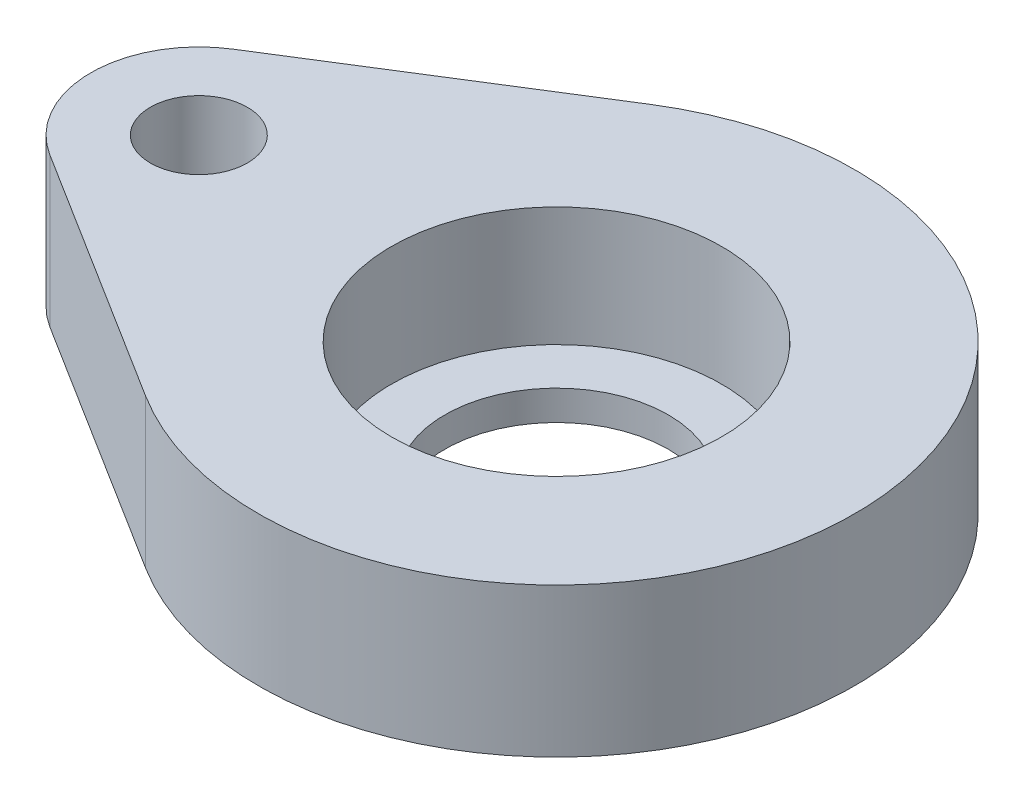
ISO-10303-21;
HEADER;
FILE_DESCRIPTION(('STEP AP214'),'2;1');
FILE_NAME('part.step','',(''),(''),'','','');
FILE_SCHEMA(('AUTOMOTIVE_DESIGN { 1 0 10303 214 1 1 1 1 }'));
ENDSEC;
DATA;
#1=APPLICATION_CONTEXT('core data for automotive mechanical design processes');
#2=APPLICATION_PROTOCOL_DEFINITION('international standard','automotive_design',2000,#1);
#3=PRODUCT_CONTEXT('',#1,'mechanical');
#4=PRODUCT('Part','Part','',(#3));
#5=PRODUCT_RELATED_PRODUCT_CATEGORY('part','',(#4));
#6=PRODUCT_DEFINITION_FORMATION('','',#4);
#7=PRODUCT_DEFINITION_CONTEXT('part definition',#1,'design');
#8=PRODUCT_DEFINITION('design','',#6,#7);
#9=PRODUCT_DEFINITION_SHAPE('','',#8);
#10=(LENGTH_UNIT() NAMED_UNIT(*) SI_UNIT(.MILLI.,.METRE.));
#11=(NAMED_UNIT(*) PLANE_ANGLE_UNIT() SI_UNIT($,.RADIAN.));
#12=(NAMED_UNIT(*) SI_UNIT($,.STERADIAN.) SOLID_ANGLE_UNIT());
#13=UNCERTAINTY_MEASURE_WITH_UNIT(LENGTH_MEASURE(1.E-05),#10,'distance_accuracy_value','');
#14=(GEOMETRIC_REPRESENTATION_CONTEXT(3) GLOBAL_UNCERTAINTY_ASSIGNED_CONTEXT((#13)) GLOBAL_UNIT_ASSIGNED_CONTEXT((#10,
#11,#12)) REPRESENTATION_CONTEXT('',''));
#15=CARTESIAN_POINT('',(0.,0.,0.));
#16=DIRECTION('',(0.,0.,1.));
#17=DIRECTION('',(1.,0.,0.));
#18=AXIS2_PLACEMENT_3D('',#15,#16,#17);
#19=CARTESIAN_POINT('',(0.,10.,0.));
#20=DIRECTION('',(0.,-1.,0.));
#21=DIRECTION('',(0.,0.,-1.));
#22=AXIS2_PLACEMENT_3D('',#19,#20,#21);
#23=CYLINDRICAL_SURFACE('',#22,7.25);
#24=CARTESIAN_POINT('',(0.,0.,0.));
#25=DIRECTION('',(0.,1.,0.));
#26=DIRECTION('',(0.,0.,1.));
#27=AXIS2_PLACEMENT_3D('',#24,#25,#26);
#28=CIRCLE('',#27,7.25);
#29=CARTESIAN_POINT('',(-3.8515625,0.,-6.14230952562582));
#30=VERTEX_POINT('',#29);
#31=CARTESIAN_POINT('',(-3.8515625,0.,6.14230952562582));
#32=VERTEX_POINT('',#31);
#33=EDGE_CURVE('E100',#30,#32,#28,.T.);
#34=ORIENTED_EDGE('',*,*,#33,.T.);
#35=DIRECTION('',(0.,-1.,0.));
#36=VECTOR('',#35,1.);
#37=CARTESIAN_POINT('',(-3.8515625,10.,6.14230952562582));
#38=LINE('',#37,#36);
#39=CARTESIAN_POINT('',(-3.8515625,10.,6.14230952562582));
#40=VERTEX_POINT('',#39);
#41=EDGE_CURVE('E11',#40,#32,#38,.T.);
#42=ORIENTED_EDGE('',*,*,#41,.F.);
#43=CARTESIAN_POINT('',(0.,10.,0.));
#44=DIRECTION('',(0.,1.,0.));
#45=DIRECTION('',(0.,0.,1.));
#46=AXIS2_PLACEMENT_3D('',#43,#44,#45);
#47=CIRCLE('',#46,7.25);
#48=CARTESIAN_POINT('',(-3.8515625,10.,-6.14230952562582));
#49=VERTEX_POINT('',#48);
#50=EDGE_CURVE('E88',#49,#40,#47,.T.);
#51=ORIENTED_EDGE('',*,*,#50,.F.);
#52=DIRECTION('',(0.,-1.,0.));
#53=VECTOR('',#52,1.);
#54=CARTESIAN_POINT('',(-3.8515625,10.,-6.14230952562582));
#55=LINE('',#54,#53);
#56=EDGE_CURVE('E96',#49,#30,#55,.T.);
#57=ORIENTED_EDGE('',*,*,#56,.T.);
#58=EDGE_LOOP('',(#34,#42,#51,#57));
#59=FACE_BOUND('',#58,.T.);
#60=ADVANCED_FACE('F37',(#59),#23,.T.);
#61=CARTESIAN_POINT('',(-3.8515625,10.,6.14230952562582));
#62=DIRECTION('',(0.53125,0.,-0.847215106982873));
#63=DIRECTION('',(-0.847215106982873,0.,-0.53125));
#64=AXIS2_PLACEMENT_3D('',#61,#62,#63);
#65=PLANE('',#64);
#66=DIRECTION('',(0.847215106982873,0.,0.53125));
#67=VECTOR('',#66,1.);
#68=CARTESIAN_POINT('',(-3.8515625,0.,6.14230952562582));
#69=LINE('',#68,#67);
#70=CARTESIAN_POINT('',(13.375,0.,16.9443021396575));
#71=VERTEX_POINT('',#70);
#72=EDGE_CURVE('E92',#32,#71,#69,.T.);
#73=ORIENTED_EDGE('',*,*,#72,.T.);
#74=DIRECTION('',(0.,-1.,0.));
#75=VECTOR('',#74,1.);
#76=CARTESIAN_POINT('',(13.375,10.,16.9443021396575));
#77=LINE('',#76,#75);
#78=CARTESIAN_POINT('',(13.375,10.,16.9443021396575));
#79=VERTEX_POINT('',#78);
#80=EDGE_CURVE('E45',#79,#71,#77,.T.);
#81=ORIENTED_EDGE('',*,*,#80,.F.);
#82=DIRECTION('',(0.847215106982873,0.,0.53125));
#83=VECTOR('',#82,1.);
#84=CARTESIAN_POINT('',(-3.8515625,10.,6.14230952562582));
#85=LINE('',#84,#83);
#86=EDGE_CURVE('E83',#40,#79,#85,.T.);
#87=ORIENTED_EDGE('',*,*,#86,.F.);
#88=ORIENTED_EDGE('',*,*,#41,.T.);
#89=EDGE_LOOP('',(#73,#81,#87,#88));
#90=FACE_BOUND('',#89,.T.);
#91=ADVANCED_FACE('F91',(#90),#65,.F.);
#92=CARTESIAN_POINT('',(24.,10.,0.));
#93=DIRECTION('',(0.,-1.,0.));
#94=DIRECTION('',(0.,0.,-1.));
#95=AXIS2_PLACEMENT_3D('',#92,#93,#94);
#96=CYLINDRICAL_SURFACE('',#95,20.);
#97=CARTESIAN_POINT('',(24.,0.,0.));
#98=DIRECTION('',(0.,1.,0.));
#99=DIRECTION('',(0.,0.,-1.));
#100=AXIS2_PLACEMENT_3D('',#97,#98,#99);
#101=CIRCLE('',#100,20.);
#102=CARTESIAN_POINT('',(13.375,0.,-16.9443021396574));
#103=VERTEX_POINT('',#102);
#104=EDGE_CURVE('E70',#71,#103,#101,.T.);
#105=ORIENTED_EDGE('',*,*,#104,.T.);
#106=DIRECTION('',(0.,-1.,0.));
#107=VECTOR('',#106,1.);
#108=CARTESIAN_POINT('',(13.375,10.,-16.9443021396574));
#109=LINE('',#108,#107);
#110=CARTESIAN_POINT('',(13.375,10.,-16.9443021396574));
#111=VERTEX_POINT('',#110);
#112=EDGE_CURVE('E93',#111,#103,#109,.T.);
#113=ORIENTED_EDGE('',*,*,#112,.F.);
#114=CARTESIAN_POINT('',(24.,10.,0.));
#115=DIRECTION('',(0.,1.,0.));
#116=DIRECTION('',(0.,0.,-1.));
#117=AXIS2_PLACEMENT_3D('',#114,#115,#116);
#118=CIRCLE('',#117,20.);
#119=EDGE_CURVE('E86',#79,#111,#118,.T.);
#120=ORIENTED_EDGE('',*,*,#119,.F.);
#121=ORIENTED_EDGE('',*,*,#80,.T.);
#122=EDGE_LOOP('',(#105,#113,#120,#121));
#123=FACE_BOUND('',#122,.T.);
#124=ADVANCED_FACE('F94',(#123),#96,.T.);
#125=CARTESIAN_POINT('',(-3.8515625,10.,-6.14230952562582));
#126=DIRECTION('',(0.53125,0.,0.847215106982873));
#127=DIRECTION('',(0.847215106982872,0.,-0.53125));
#128=AXIS2_PLACEMENT_3D('',#125,#126,#127);
#129=PLANE('',#128);
#130=DIRECTION('',(-0.847215106982873,0.,0.53125));
#131=VECTOR('',#130,1.);
#132=CARTESIAN_POINT('',(-3.8515625,0.,-6.14230952562582));
#133=LINE('',#132,#131);
#134=EDGE_CURVE('E76',#103,#30,#133,.T.);
#135=ORIENTED_EDGE('',*,*,#134,.T.);
#136=ORIENTED_EDGE('',*,*,#56,.F.);
#137=DIRECTION('',(-0.847215106982873,0.,0.53125));
#138=VECTOR('',#137,1.);
#139=CARTESIAN_POINT('',(-3.8515625,10.,-6.14230952562582));
#140=LINE('',#139,#138);
#141=EDGE_CURVE('E53',#111,#49,#140,.T.);
#142=ORIENTED_EDGE('',*,*,#141,.F.);
#143=ORIENTED_EDGE('',*,*,#112,.T.);
#144=EDGE_LOOP('',(#135,#136,#142,#143));
#145=FACE_BOUND('',#144,.T.);
#146=ADVANCED_FACE('F108',(#145),#129,.F.);
#147=CARTESIAN_POINT('',(0.,10.,0.));
#148=DIRECTION('',(0.,1.,0.));
#149=DIRECTION('',(0.,0.,1.));
#150=AXIS2_PLACEMENT_3D('',#147,#148,#149);
#151=PLANE('',#150);
#152=CARTESIAN_POINT('',(0.,10.,0.));
#153=DIRECTION('',(0.,1.,0.));
#154=DIRECTION('',(0.,0.,1.));
#155=AXIS2_PLACEMENT_3D('',#152,#153,#154);
#156=CIRCLE('',#155,3.25);
#157=CARTESIAN_POINT('',(0.,10.,3.25));
#158=VERTEX_POINT('',#157);
#159=EDGE_CURVE('E121',#158,#158,#156,.T.);
#160=ORIENTED_EDGE('',*,*,#159,.F.);
#161=EDGE_LOOP('',(#160));
#162=FACE_BOUND('',#161,.T.);
#163=CARTESIAN_POINT('',(24.,10.,0.));
#164=DIRECTION('',(0.,1.,0.));
#165=DIRECTION('',(0.,0.,1.));
#166=AXIS2_PLACEMENT_3D('',#163,#164,#165);
#167=CIRCLE('',#166,11.075);
#168=CARTESIAN_POINT('',(24.,10.,11.075));
#169=VERTEX_POINT('',#168);
#170=EDGE_CURVE('E117',#169,#169,#167,.T.);
#171=ORIENTED_EDGE('',*,*,#170,.F.);
#172=EDGE_LOOP('',(#171));
#173=FACE_BOUND('',#172,.T.);
#174=ORIENTED_EDGE('',*,*,#50,.T.);
#175=ORIENTED_EDGE('',*,*,#86,.T.);
#176=ORIENTED_EDGE('',*,*,#119,.T.);
#177=ORIENTED_EDGE('',*,*,#141,.T.);
#178=EDGE_LOOP('',(#174,#175,#176,#177));
#179=FACE_BOUND('',#178,.T.);
#180=ADVANCED_FACE('F84',(#162,#173,#179),#151,.T.);
#181=CARTESIAN_POINT('',(0.,0.,0.));
#182=DIRECTION('',(0.,1.,0.));
#183=DIRECTION('',(0.,0.,1.));
#184=AXIS2_PLACEMENT_3D('',#181,#182,#183);
#185=PLANE('',#184);
#186=CARTESIAN_POINT('',(24.,0.,0.));
#187=DIRECTION('',(0.,1.,0.));
#188=DIRECTION('',(0.,0.,1.));
#189=AXIS2_PLACEMENT_3D('',#186,#187,#188);
#190=CIRCLE('',#189,7.5);
#191=CARTESIAN_POINT('',(24.,0.,7.5));
#192=VERTEX_POINT('',#191);
#193=EDGE_CURVE('E118',#192,#192,#190,.F.);
#194=ORIENTED_EDGE('',*,*,#193,.F.);
#195=EDGE_LOOP('',(#194));
#196=FACE_BOUND('',#195,.T.);
#197=CARTESIAN_POINT('',(0.,0.,0.));
#198=DIRECTION('',(0.,1.,0.));
#199=DIRECTION('',(0.,0.,1.));
#200=AXIS2_PLACEMENT_3D('',#197,#198,#199);
#201=CIRCLE('',#200,1.5);
#202=CARTESIAN_POINT('',(0.,0.,1.5));
#203=VERTEX_POINT('',#202);
#204=EDGE_CURVE('E130',#203,#203,#201,.F.);
#205=ORIENTED_EDGE('',*,*,#204,.F.);
#206=EDGE_LOOP('',(#205));
#207=FACE_BOUND('',#206,.T.);
#208=ORIENTED_EDGE('',*,*,#33,.F.);
#209=ORIENTED_EDGE('',*,*,#134,.F.);
#210=ORIENTED_EDGE('',*,*,#104,.F.);
#211=ORIENTED_EDGE('',*,*,#72,.F.);
#212=EDGE_LOOP('',(#208,#209,#210,#211));
#213=FACE_BOUND('',#212,.T.);
#214=ADVANCED_FACE('F111',(#196,#207,#213),#185,.F.);
#215=CARTESIAN_POINT('',(24.,2.,0.));
#216=DIRECTION('',(0.,1.,0.));
#217=DIRECTION('',(0.,0.,1.));
#218=AXIS2_PLACEMENT_3D('',#215,#216,#217);
#219=CYLINDRICAL_SURFACE('',#218,11.075);
#220=CARTESIAN_POINT('',(24.,2.,0.));
#221=DIRECTION('',(0.,1.,0.));
#222=DIRECTION('',(0.,0.,1.));
#223=AXIS2_PLACEMENT_3D('',#220,#221,#222);
#224=CIRCLE('',#223,11.075);
#225=CARTESIAN_POINT('',(24.,2.,11.075));
#226=VERTEX_POINT('',#225);
#227=EDGE_CURVE('E114',#226,#226,#224,.T.);
#228=ORIENTED_EDGE('',*,*,#227,.F.);
#229=EDGE_LOOP('',(#228));
#230=FACE_BOUND('',#229,.T.);
#231=ORIENTED_EDGE('',*,*,#170,.T.);
#232=EDGE_LOOP('',(#231));
#233=FACE_BOUND('',#232,.T.);
#234=ADVANCED_FACE('F144',(#230,#233),#219,.F.);
#235=CARTESIAN_POINT('',(24.,2.,0.));
#236=DIRECTION('',(0.,1.,0.));
#237=DIRECTION('',(0.,0.,1.));
#238=AXIS2_PLACEMENT_3D('',#235,#236,#237);
#239=PLANE('',#238);
#240=CARTESIAN_POINT('',(24.,2.,0.));
#241=DIRECTION('',(0.,1.,0.));
#242=DIRECTION('',(0.,0.,1.));
#243=AXIS2_PLACEMENT_3D('',#240,#241,#242);
#244=CIRCLE('',#243,7.5);
#245=CARTESIAN_POINT('',(24.,2.,7.5));
#246=VERTEX_POINT('',#245);
#247=EDGE_CURVE('E129',#246,#246,#244,.T.);
#248=ORIENTED_EDGE('',*,*,#247,.F.);
#249=EDGE_LOOP('',(#248));
#250=FACE_BOUND('',#249,.T.);
#251=ORIENTED_EDGE('',*,*,#227,.T.);
#252=EDGE_LOOP('',(#251));
#253=FACE_BOUND('',#252,.T.);
#254=ADVANCED_FACE('F140',(#250,#253),#239,.T.);
#255=CARTESIAN_POINT('',(0.,2.,0.));
#256=DIRECTION('',(0.,1.,0.));
#257=DIRECTION('',(0.,0.,1.));
#258=AXIS2_PLACEMENT_3D('',#255,#256,#257);
#259=CYLINDRICAL_SURFACE('',#258,3.25);
#260=CARTESIAN_POINT('',(0.,2.,0.));
#261=DIRECTION('',(0.,1.,0.));
#262=DIRECTION('',(0.,0.,1.));
#263=AXIS2_PLACEMENT_3D('',#260,#261,#262);
#264=CIRCLE('',#263,3.25);
#265=CARTESIAN_POINT('',(0.,2.,3.25));
#266=VERTEX_POINT('',#265);
#267=EDGE_CURVE('E103',#266,#266,#264,.T.);
#268=ORIENTED_EDGE('',*,*,#267,.F.);
#269=EDGE_LOOP('',(#268));
#270=FACE_BOUND('',#269,.T.);
#271=ORIENTED_EDGE('',*,*,#159,.T.);
#272=EDGE_LOOP('',(#271));
#273=FACE_BOUND('',#272,.T.);
#274=ADVANCED_FACE('F143',(#270,#273),#259,.F.);
#275=CARTESIAN_POINT('',(0.,2.,0.));
#276=DIRECTION('',(0.,1.,0.));
#277=DIRECTION('',(0.,0.,1.));
#278=AXIS2_PLACEMENT_3D('',#275,#276,#277);
#279=PLANE('',#278);
#280=CARTESIAN_POINT('',(0.,2.,0.));
#281=DIRECTION('',(0.,1.,0.));
#282=DIRECTION('',(0.,0.,1.));
#283=AXIS2_PLACEMENT_3D('',#280,#281,#282);
#284=CIRCLE('',#283,1.5);
#285=CARTESIAN_POINT('',(0.,2.,1.5));
#286=VERTEX_POINT('',#285);
#287=EDGE_CURVE('E126',#286,#286,#284,.T.);
#288=ORIENTED_EDGE('',*,*,#287,.F.);
#289=EDGE_LOOP('',(#288));
#290=FACE_BOUND('',#289,.T.);
#291=ORIENTED_EDGE('',*,*,#267,.T.);
#292=EDGE_LOOP('',(#291));
#293=FACE_BOUND('',#292,.T.);
#294=ADVANCED_FACE('F202',(#290,#293),#279,.T.);
#295=CARTESIAN_POINT('',(0.,-21.2132034355964,0.));
#296=DIRECTION('',(0.,1.,0.));
#297=DIRECTION('',(0.,0.,1.));
#298=AXIS2_PLACEMENT_3D('',#295,#296,#297);
#299=CYLINDRICAL_SURFACE('',#298,1.5);
#300=ORIENTED_EDGE('',*,*,#204,.T.);
#301=EDGE_LOOP('',(#300));
#302=FACE_BOUND('',#301,.T.);
#303=ORIENTED_EDGE('',*,*,#287,.T.);
#304=EDGE_LOOP('',(#303));
#305=FACE_BOUND('',#304,.T.);
#306=ADVANCED_FACE('F225',(#302,#305),#299,.F.);
#307=CARTESIAN_POINT('',(24.,-21.2132034355964,0.));
#308=DIRECTION('',(0.,1.,0.));
#309=DIRECTION('',(0.,0.,1.));
#310=AXIS2_PLACEMENT_3D('',#307,#308,#309);
#311=CYLINDRICAL_SURFACE('',#310,7.5);
#312=ORIENTED_EDGE('',*,*,#193,.T.);
#313=EDGE_LOOP('',(#312));
#314=FACE_BOUND('',#313,.T.);
#315=ORIENTED_EDGE('',*,*,#247,.T.);
#316=EDGE_LOOP('',(#315));
#317=FACE_BOUND('',#316,.T.);
#318=ADVANCED_FACE('F138',(#314,#317),#311,.F.);
#319=CLOSED_SHELL('',(#60,#91,#124,#146,#180,#214,#234,#254,#274,#294,#306,#318));
#320=MANIFOLD_SOLID_BREP('B2',#319);
#321=ADVANCED_BREP_SHAPE_REPRESENTATION('',(#18,#320),#14);
#322=SHAPE_DEFINITION_REPRESENTATION(#9,#321);
ENDSEC;
END-ISO-10303-21;
